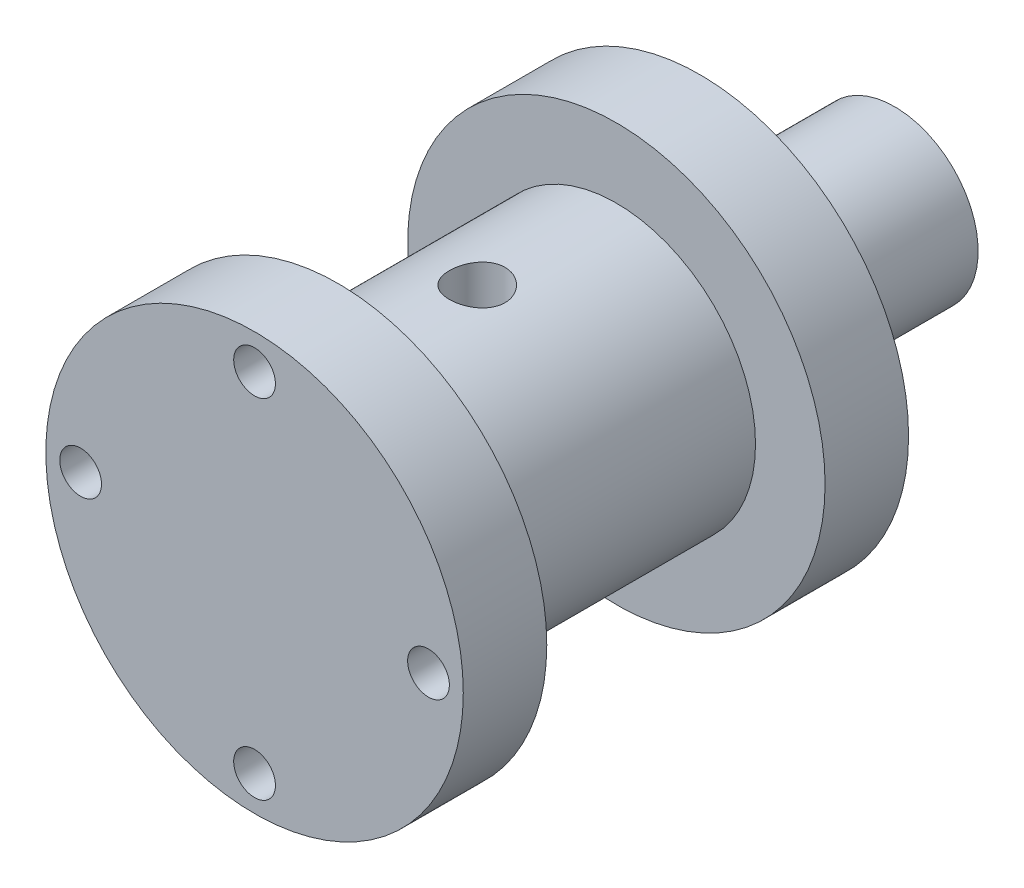
ISO-10303-21;
HEADER;
FILE_DESCRIPTION(('STEP AP214'),'2;1');
FILE_NAME('part.step','',(''),(''),'','','');
FILE_SCHEMA(('AUTOMOTIVE_DESIGN { 1 0 10303 214 1 1 1 1 }'));
ENDSEC;
DATA;
#1=APPLICATION_CONTEXT('core data for automotive mechanical design processes');
#2=APPLICATION_PROTOCOL_DEFINITION('international standard','automotive_design',2000,#1);
#3=PRODUCT_CONTEXT('',#1,'mechanical');
#4=PRODUCT('Part','Part','',(#3));
#5=PRODUCT_RELATED_PRODUCT_CATEGORY('part','',(#4));
#6=PRODUCT_DEFINITION_FORMATION('','',#4);
#7=PRODUCT_DEFINITION_CONTEXT('part definition',#1,'design');
#8=PRODUCT_DEFINITION('design','',#6,#7);
#9=PRODUCT_DEFINITION_SHAPE('','',#8);
#10=(LENGTH_UNIT() NAMED_UNIT(*) SI_UNIT(.MILLI.,.METRE.));
#11=(NAMED_UNIT(*) PLANE_ANGLE_UNIT() SI_UNIT($,.RADIAN.));
#12=(NAMED_UNIT(*) SI_UNIT($,.STERADIAN.) SOLID_ANGLE_UNIT());
#13=UNCERTAINTY_MEASURE_WITH_UNIT(LENGTH_MEASURE(1.E-05),#10,'distance_accuracy_value','');
#14=(GEOMETRIC_REPRESENTATION_CONTEXT(3) GLOBAL_UNCERTAINTY_ASSIGNED_CONTEXT((#13)) GLOBAL_UNIT_ASSIGNED_CONTEXT((#10,
#11,#12)) REPRESENTATION_CONTEXT('',''));
#15=CARTESIAN_POINT('',(0.,0.,0.));
#16=DIRECTION('',(0.,0.,1.));
#17=DIRECTION('',(1.,0.,0.));
#18=AXIS2_PLACEMENT_3D('',#15,#16,#17);
#19=CARTESIAN_POINT('',(0.,0.,-5.));
#20=DIRECTION('',(0.,0.,1.));
#21=DIRECTION('',(1.,0.,0.));
#22=AXIS2_PLACEMENT_3D('',#19,#20,#21);
#23=CYLINDRICAL_SURFACE('',#22,5.);
#24=CARTESIAN_POINT('',(0.,-5.,1.));
#25=CARTESIAN_POINT('',(-0.0555769067926332,-4.99999897580871,0.999997955501655));
#26=CARTESIAN_POINT('',(-0.111179660201522,-4.99906385178231,0.995351157032355));
#27=CARTESIAN_POINT('',(-0.220813507689019,-4.99542365623231,0.976901499884755));
#28=CARTESIAN_POINT('',(-0.274843317541356,-4.99271717860186,0.96309136719849));
#29=CARTESIAN_POINT('',(-0.379730305263313,-4.98583649278287,0.926758726379211));
#30=CARTESIAN_POINT('',(-0.430590467933134,-4.98166369076718,0.904244563155312));
#31=CARTESIAN_POINT('',(-0.527807988864225,-4.97230398035314,0.851167752488706));
#32=CARTESIAN_POINT('',(-0.574165615075812,-4.96711713235707,0.820605584392795));
#33=CARTESIAN_POINT('',(-0.661693477314865,-4.9562216532997,0.751861505708566));
#34=CARTESIAN_POINT('',(-0.702793951158524,-4.95050745504347,0.713591644608798));
#35=CARTESIAN_POINT('',(-0.778036756608028,-4.93924180452588,0.630707583608298));
#36=CARTESIAN_POINT('',(-0.812178544770424,-4.93369036500424,0.586092888664882));
#37=CARTESIAN_POINT('',(-0.87283175334762,-4.92332441812615,0.491283806988125));
#38=CARTESIAN_POINT('',(-0.899270938865866,-4.91851707364946,0.441042356203641));
#39=CARTESIAN_POINT('',(-0.943305666580308,-4.91026268058418,0.336718180995921));
#40=CARTESIAN_POINT('',(-0.960902082437238,-4.90681549761962,0.282635836653655));
#41=CARTESIAN_POINT('',(-0.986525299884827,-4.90172805252204,0.172915636092083));
#42=CARTESIAN_POINT('',(-0.994674497958777,-4.90006470107188,0.117307455857774));
#43=CARTESIAN_POINT('',(-1.00155212772612,-4.89866375060627,0.00549017863565777));
#44=CARTESIAN_POINT('',(-1.0002815227135,-4.89892595467841,-0.0507188563201451));
#45=CARTESIAN_POINT('',(-0.988454573101819,-4.90132551148185,-0.161246788021003));
#46=CARTESIAN_POINT('',(-0.978038540243905,-4.90343452858763,-0.215581405627314));
#47=CARTESIAN_POINT('',(-0.94843788462305,-4.90924546160001,-0.321716076663002));
#48=CARTESIAN_POINT('',(-0.929252843100681,-4.91294745357779,-0.373516008919008));
#49=CARTESIAN_POINT('',(-0.88252478367472,-4.92155618500408,-0.473515261703599));
#50=CARTESIAN_POINT('',(-0.854926151232114,-4.92647089813704,-0.521687879569172));
#51=CARTESIAN_POINT('',(-0.792193574572679,-4.93694618773062,-0.612770849972814));
#52=CARTESIAN_POINT('',(-0.757058764356829,-4.94250683838366,-0.655680596851157));
#53=CARTESIAN_POINT('',(-0.679499934560584,-4.95377021241462,-0.735829402456936));
#54=CARTESIAN_POINT('',(-0.636956161212445,-4.95947369210905,-0.77295256785913));
#55=CARTESIAN_POINT('',(-0.54618502406201,-4.97028848714408,-0.839553846301224));
#56=CARTESIAN_POINT('',(-0.497957587379389,-4.97539979488974,-0.869031861293579));
#57=CARTESIAN_POINT('',(-0.397059386878921,-4.98446690160887,-0.919527509225975));
#58=CARTESIAN_POINT('',(-0.3443818195853,-4.98842088848272,-0.940531893644537));
#59=CARTESIAN_POINT('',(-0.236148976448665,-4.99471408987858,-0.973360474038567));
#60=CARTESIAN_POINT('',(-0.18059405007245,-4.99705350000531,-0.985185782073628));
#61=CARTESIAN_POINT('',(-0.0691794056271506,-4.99982671866868,-0.999156453794277));
#62=CARTESIAN_POINT('',(-0.0133403283255764,-5.0002917465247,-1.00146041954027));
#63=CARTESIAN_POINT('',(0.0979249341927138,-4.99935051930103,-0.996750141057819));
#64=CARTESIAN_POINT('',(0.153351142443793,-4.99794436941446,-0.989736420647404));
#65=CARTESIAN_POINT('',(0.261705659946541,-4.99343832008018,-0.966721626456044));
#66=CARTESIAN_POINT('',(0.314651948339903,-4.99035376404206,-0.950801931502097));
#67=CARTESIAN_POINT('',(0.417123627499667,-4.98283552061033,-0.910516017344191));
#68=CARTESIAN_POINT('',(0.466648761637539,-4.97840173214227,-0.88614916532317));
#69=CARTESIAN_POINT('',(0.561541173686217,-4.96859911533294,-0.829317509348687));
#70=CARTESIAN_POINT('',(0.606850126752188,-4.96321950437052,-0.796757218961055));
#71=CARTESIAN_POINT('',(0.691418019119206,-4.95214734829882,-0.724590808792719));
#72=CARTESIAN_POINT('',(0.730676308930762,-4.94645476968388,-0.684983933600133));
#73=CARTESIAN_POINT('',(0.802640590774176,-4.93529303556965,-0.599126648108876));
#74=CARTESIAN_POINT('',(0.835237702448655,-4.92982860233304,-0.552784255778663));
#75=CARTESIAN_POINT('',(0.892185420051205,-4.91984191796194,-0.455188638643321));
#76=CARTESIAN_POINT('',(0.916536355922902,-4.91531962913342,-0.403935610426448));
#77=CARTESIAN_POINT('',(0.95615184158196,-4.90776740584383,-0.298231753850452));
#78=CARTESIAN_POINT('',(0.971463499791051,-4.90472974872186,-0.243799158789681));
#79=CARTESIAN_POINT('',(0.992708651627196,-4.90047436792025,-0.133066546509095));
#80=CARTESIAN_POINT('',(0.998643368225112,-4.89925640691111,-0.0767667737906529));
#81=CARTESIAN_POINT('',(1.00092091086747,-4.89879149631379,0.0350088645443183));
#82=CARTESIAN_POINT('',(0.997435788070896,-4.89950919189301,0.0904811489270091));
#83=CARTESIAN_POINT('',(0.981352304100061,-4.90275573484614,0.200031649905026));
#84=CARTESIAN_POINT('',(0.968754016129298,-4.90528456767169,0.254109877694805));
#85=CARTESIAN_POINT('',(0.934878568498954,-4.91185264219158,0.359227711240545));
#86=CARTESIAN_POINT('',(0.913622506717345,-4.9158882101883,0.410274360502415));
#87=CARTESIAN_POINT('',(0.863054644601604,-4.9250171497417,0.508103720734441));
#88=CARTESIAN_POINT('',(0.833742168774882,-4.93011060998894,0.554886073725137));
#89=CARTESIAN_POINT('',(0.767305914786414,-4.94088960523225,0.643715572150314));
#90=CARTESIAN_POINT('',(0.73005788723518,-4.94658372909699,0.685668765267595));
#91=CARTESIAN_POINT('',(0.649064369013141,-4.95786081871954,0.762786205529171));
#92=CARTESIAN_POINT('',(0.605317387153335,-4.96344375863184,0.797948890317272));
#93=CARTESIAN_POINT('',(0.512017629088247,-4.97393832387971,0.860834643946447));
#94=CARTESIAN_POINT('',(0.462408884429835,-4.97884231219246,0.888476003280025));
#95=CARTESIAN_POINT('',(0.359166360940733,-4.98735125085,0.934986122596591));
#96=CARTESIAN_POINT('',(0.305536260863126,-4.99095737138616,0.953862789532492));
#97=CARTESIAN_POINT('',(0.209821488923779,-4.9957637259537,0.978651948044716));
#98=CARTESIAN_POINT('',(0.168281664013784,-4.99734303158452,0.986643193707757));
#99=CARTESIAN_POINT('',(0.0844995252100667,-4.99946154139893,0.997317912358364));
#100=CARTESIAN_POINT('',(0.0422572337486189,-5.00000077873155,1.00000155450977));
#101=CARTESIAN_POINT('',(0.,-5.,1.));
#102=B_SPLINE_CURVE_WITH_KNOTS('',3,(#24,#25,#26,#27,#28,#29,#30,#31,#32,#33,#34,#35,#36,#37,
#38,#39,#40,#41,#42,#43,#44,#45,#46,#47,#48,#49,#50,#51,#52,#53,#54,#55,#56,#57,#58,#59,#60,#61,
#62,#63,#64,#65,#66,#67,#68,#69,#70,#71,#72,#73,#74,#75,#76,#77,#78,#79,#80,#81,#82,#83,#84,#85,
#86,#87,#88,#89,#90,#91,#92,#93,#94,#95,#96,#97,#98,#99,#100,#101),.UNSPECIFIED.,.T.,.F.,(4,2,2,
2,2,2,2,2,2,2,2,2,2,2,2,2,2,2,2,2,2,2,2,2,2,2,2,2,2,2,2,2,2,2,2,2,2,2,4),(0.,0.166576130661258,
0.333284650691323,0.499833735250341,0.666372902230863,0.834932670112186,1.00350559674737,
1.17361195005923,1.34370149365197,1.51156185103587,1.67940504281225,1.84471727006278,
2.0100373925373,2.17647490203593,2.3429315474967,2.51238252491351,2.6818356753982,
2.85155274854024,3.02124925698036,3.18810735676265,3.35495607657868,3.52030453950723,
3.68566539216022,3.85305066033359,4.0204538834593,4.19040628579226,4.36035188723466,
4.52940381032723,4.69843368330415,4.86439722567701,5.03035943492608,5.1959196125311,
5.36149367581866,5.52988076239143,5.6983065453293,5.86849496675637,6.03852955517518,
6.16518775289894,6.29184191370996),.UNSPECIFIED.);
#103=CARTESIAN_POINT('',(0.,-5.,1.));
#104=VERTEX_POINT('',#103);
#105=EDGE_CURVE('E37',#104,#104,#102,.T.);
#106=ORIENTED_EDGE('',*,*,#105,.F.);
#107=EDGE_LOOP('',(#106));
#108=FACE_BOUND('',#107,.T.);
#109=CARTESIAN_POINT('',(0.,5.,1.));
#110=CARTESIAN_POINT('',(0.0555769067926332,4.99999897580871,0.999997955501655));
#111=CARTESIAN_POINT('',(0.111179660201522,4.99906385178231,0.995351157032355));
#112=CARTESIAN_POINT('',(0.220813507689019,4.99542365623231,0.976901499884755));
#113=CARTESIAN_POINT('',(0.274843317541356,4.99271717860186,0.96309136719849));
#114=CARTESIAN_POINT('',(0.379730305263313,4.98583649278287,0.926758726379211));
#115=CARTESIAN_POINT('',(0.430590467933134,4.98166369076718,0.904244563155312));
#116=CARTESIAN_POINT('',(0.527807988864225,4.97230398035314,0.851167752488706));
#117=CARTESIAN_POINT('',(0.574165615075812,4.96711713235707,0.820605584392795));
#118=CARTESIAN_POINT('',(0.661693477314865,4.9562216532997,0.751861505708566));
#119=CARTESIAN_POINT('',(0.702793951158524,4.95050745504347,0.713591644608798));
#120=CARTESIAN_POINT('',(0.778036756608028,4.93924180452588,0.630707583608298));
#121=CARTESIAN_POINT('',(0.812178544770424,4.93369036500424,0.586092888664882));
#122=CARTESIAN_POINT('',(0.87283175334762,4.92332441812615,0.491283806988125));
#123=CARTESIAN_POINT('',(0.899270938865866,4.91851707364946,0.441042356203641));
#124=CARTESIAN_POINT('',(0.943305666580308,4.91026268058418,0.336718180995921));
#125=CARTESIAN_POINT('',(0.960902082437238,4.90681549761962,0.282635836653655));
#126=CARTESIAN_POINT('',(0.986525299884827,4.90172805252204,0.172915636092083));
#127=CARTESIAN_POINT('',(0.994674497958777,4.90006470107188,0.117307455857774));
#128=CARTESIAN_POINT('',(1.00155212772612,4.89866375060627,0.00549017863565777));
#129=CARTESIAN_POINT('',(1.0002815227135,4.89892595467841,-0.0507188563201451));
#130=CARTESIAN_POINT('',(0.988454573101819,4.90132551148185,-0.161246788021003));
#131=CARTESIAN_POINT('',(0.978038540243905,4.90343452858763,-0.215581405627314));
#132=CARTESIAN_POINT('',(0.94843788462305,4.90924546160001,-0.321716076663002));
#133=CARTESIAN_POINT('',(0.929252843100681,4.91294745357779,-0.373516008919008));
#134=CARTESIAN_POINT('',(0.88252478367472,4.92155618500408,-0.473515261703599));
#135=CARTESIAN_POINT('',(0.854926151232114,4.92647089813704,-0.521687879569172));
#136=CARTESIAN_POINT('',(0.792193574572679,4.93694618773062,-0.612770849972814));
#137=CARTESIAN_POINT('',(0.757058764356829,4.94250683838366,-0.655680596851157));
#138=CARTESIAN_POINT('',(0.679499934560584,4.95377021241462,-0.735829402456936));
#139=CARTESIAN_POINT('',(0.636956161212445,4.95947369210905,-0.77295256785913));
#140=CARTESIAN_POINT('',(0.54618502406201,4.97028848714408,-0.839553846301224));
#141=CARTESIAN_POINT('',(0.497957587379389,4.97539979488974,-0.869031861293579));
#142=CARTESIAN_POINT('',(0.397059386878921,4.98446690160887,-0.919527509225975));
#143=CARTESIAN_POINT('',(0.3443818195853,4.98842088848272,-0.940531893644537));
#144=CARTESIAN_POINT('',(0.236148976448665,4.99471408987858,-0.973360474038567));
#145=CARTESIAN_POINT('',(0.18059405007245,4.99705350000531,-0.985185782073628));
#146=CARTESIAN_POINT('',(0.0691794056271506,4.99982671866868,-0.999156453794277));
#147=CARTESIAN_POINT('',(0.0133403283255764,5.0002917465247,-1.00146041954027));
#148=CARTESIAN_POINT('',(-0.0979249341927138,4.99935051930103,-0.996750141057819));
#149=CARTESIAN_POINT('',(-0.153351142443793,4.99794436941446,-0.989736420647404));
#150=CARTESIAN_POINT('',(-0.261705659946541,4.99343832008018,-0.966721626456044));
#151=CARTESIAN_POINT('',(-0.314651948339903,4.99035376404206,-0.950801931502097));
#152=CARTESIAN_POINT('',(-0.417123627499667,4.98283552061033,-0.910516017344191));
#153=CARTESIAN_POINT('',(-0.466648761637539,4.97840173214227,-0.88614916532317));
#154=CARTESIAN_POINT('',(-0.561541173686217,4.96859911533294,-0.829317509348687));
#155=CARTESIAN_POINT('',(-0.606850126752188,4.96321950437052,-0.796757218961055));
#156=CARTESIAN_POINT('',(-0.691418019119206,4.95214734829882,-0.724590808792719));
#157=CARTESIAN_POINT('',(-0.730676308930762,4.94645476968388,-0.684983933600133));
#158=CARTESIAN_POINT('',(-0.802640590774176,4.93529303556965,-0.599126648108876));
#159=CARTESIAN_POINT('',(-0.835237702448655,4.92982860233304,-0.552784255778663));
#160=CARTESIAN_POINT('',(-0.892185420051205,4.91984191796194,-0.455188638643321));
#161=CARTESIAN_POINT('',(-0.916536355922902,4.91531962913342,-0.403935610426448));
#162=CARTESIAN_POINT('',(-0.95615184158196,4.90776740584383,-0.298231753850452));
#163=CARTESIAN_POINT('',(-0.971463499791051,4.90472974872186,-0.243799158789681));
#164=CARTESIAN_POINT('',(-0.992708651627196,4.90047436792025,-0.133066546509095));
#165=CARTESIAN_POINT('',(-0.998643368225112,4.89925640691111,-0.0767667737906529));
#166=CARTESIAN_POINT('',(-1.00092091086747,4.89879149631379,0.0350088645443183));
#167=CARTESIAN_POINT('',(-0.997435788070896,4.89950919189301,0.0904811489270091));
#168=CARTESIAN_POINT('',(-0.981352304100061,4.90275573484614,0.200031649905026));
#169=CARTESIAN_POINT('',(-0.968754016129298,4.90528456767169,0.254109877694805));
#170=CARTESIAN_POINT('',(-0.934878568498954,4.91185264219158,0.359227711240545));
#171=CARTESIAN_POINT('',(-0.913622506717345,4.9158882101883,0.410274360502415));
#172=CARTESIAN_POINT('',(-0.863054644601604,4.9250171497417,0.508103720734441));
#173=CARTESIAN_POINT('',(-0.833742168774882,4.93011060998894,0.554886073725137));
#174=CARTESIAN_POINT('',(-0.767305914786414,4.94088960523225,0.643715572150314));
#175=CARTESIAN_POINT('',(-0.73005788723518,4.94658372909699,0.685668765267595));
#176=CARTESIAN_POINT('',(-0.649064369013141,4.95786081871954,0.762786205529171));
#177=CARTESIAN_POINT('',(-0.605317387153335,4.96344375863184,0.797948890317272));
#178=CARTESIAN_POINT('',(-0.512017629088247,4.97393832387971,0.860834643946447));
#179=CARTESIAN_POINT('',(-0.462408884429835,4.97884231219246,0.888476003280025));
#180=CARTESIAN_POINT('',(-0.359166360940733,4.98735125085,0.934986122596591));
#181=CARTESIAN_POINT('',(-0.305536260863126,4.99095737138616,0.953862789532492));
#182=CARTESIAN_POINT('',(-0.209821488923779,4.9957637259537,0.978651948044716));
#183=CARTESIAN_POINT('',(-0.168281664013784,4.99734303158452,0.986643193707757));
#184=CARTESIAN_POINT('',(-0.0844995252100667,4.99946154139893,0.997317912358364));
#185=CARTESIAN_POINT('',(-0.0422572337486189,5.00000077873155,1.00000155450977));
#186=CARTESIAN_POINT('',(0.,5.,1.));
#187=B_SPLINE_CURVE_WITH_KNOTS('',3,(#109,#110,#111,#112,#113,#114,#115,#116,#117,#118,#119,
#120,#121,#122,#123,#124,#125,#126,#127,#128,#129,#130,#131,#132,#133,#134,#135,#136,#137,#138,
#139,#140,#141,#142,#143,#144,#145,#146,#147,#148,#149,#150,#151,#152,#153,#154,#155,#156,#157,
#158,#159,#160,#161,#162,#163,#164,#165,#166,#167,#168,#169,#170,#171,#172,#173,#174,#175,#176,
#177,#178,#179,#180,#181,#182,#183,#184,#185,#186),.UNSPECIFIED.,.T.,.F.,(4,2,2,2,2,2,2,2,2,2,2,
2,2,2,2,2,2,2,2,2,2,2,2,2,2,2,2,2,2,2,2,2,2,2,2,2,2,2,4),(0.,0.166576130661258,
0.333284650691323,0.499833735250341,0.666372902230863,0.834932670112186,1.00350559674737,
1.17361195005923,1.34370149365197,1.51156185103587,1.67940504281225,1.84471727006278,
2.0100373925373,2.17647490203593,2.3429315474967,2.51238252491351,2.6818356753982,
2.85155274854024,3.02124925698036,3.18810735676265,3.35495607657868,3.52030453950723,
3.68566539216022,3.85305066033359,4.0204538834593,4.19040628579226,4.36035188723466,
4.52940381032723,4.69843368330415,4.86439722567701,5.03035943492608,5.1959196125311,
5.36149367581866,5.52988076239143,5.6983065453293,5.86849496675637,6.03852955517518,
6.16518775289894,6.29184191370996),.UNSPECIFIED.);
#188=CARTESIAN_POINT('',(0.,5.,1.));
#189=VERTEX_POINT('',#188);
#190=EDGE_CURVE('E45',#189,#189,#187,.T.);
#191=ORIENTED_EDGE('',*,*,#190,.F.);
#192=EDGE_LOOP('',(#191));
#193=FACE_BOUND('',#192,.T.);
#194=CARTESIAN_POINT('',(0.,0.,-5.));
#195=DIRECTION('',(0.,0.,1.));
#196=DIRECTION('',(1.,0.,0.));
#197=AXIS2_PLACEMENT_3D('',#194,#195,#196);
#198=CIRCLE('',#197,5.);
#199=CARTESIAN_POINT('',(5.,0.,-5.));
#200=VERTEX_POINT('',#199);
#201=EDGE_CURVE('E81',#200,#200,#198,.T.);
#202=ORIENTED_EDGE('',*,*,#201,.T.);
#203=EDGE_LOOP('',(#202));
#204=FACE_BOUND('',#203,.T.);
#205=CARTESIAN_POINT('',(0.,0.,5.));
#206=DIRECTION('',(0.,0.,1.));
#207=DIRECTION('',(1.,0.,0.));
#208=AXIS2_PLACEMENT_3D('',#205,#206,#207);
#209=CIRCLE('',#208,5.);
#210=CARTESIAN_POINT('',(5.,0.,5.));
#211=VERTEX_POINT('',#210);
#212=EDGE_CURVE('E50',#211,#211,#209,.T.);
#213=ORIENTED_EDGE('',*,*,#212,.F.);
#214=EDGE_LOOP('',(#213));
#215=FACE_BOUND('',#214,.T.);
#216=ADVANCED_FACE('F33',(#108,#193,#204,#215),#23,.T.);
#217=CARTESIAN_POINT('',(0.,0.,8.));
#218=DIRECTION('',(0.,0.,-1.));
#219=DIRECTION('',(-1.,0.,0.));
#220=AXIS2_PLACEMENT_3D('',#217,#218,#219);
#221=CYLINDRICAL_SURFACE('',#220,7.5);
#222=CARTESIAN_POINT('',(0.,0.,8.));
#223=DIRECTION('',(0.,0.,1.));
#224=DIRECTION('',(1.,0.,0.));
#225=AXIS2_PLACEMENT_3D('',#222,#223,#224);
#226=CIRCLE('',#225,7.5);
#227=CARTESIAN_POINT('',(7.5,0.,8.));
#228=VERTEX_POINT('',#227);
#229=EDGE_CURVE('E85',#228,#228,#226,.T.);
#230=ORIENTED_EDGE('',*,*,#229,.F.);
#231=EDGE_LOOP('',(#230));
#232=FACE_BOUND('',#231,.T.);
#233=CARTESIAN_POINT('',(0.,0.,5.));
#234=DIRECTION('',(0.,0.,1.));
#235=DIRECTION('',(1.,0.,0.));
#236=AXIS2_PLACEMENT_3D('',#233,#234,#235);
#237=CIRCLE('',#236,7.5);
#238=CARTESIAN_POINT('',(7.5,0.,5.));
#239=VERTEX_POINT('',#238);
#240=EDGE_CURVE('E88',#239,#239,#237,.T.);
#241=ORIENTED_EDGE('',*,*,#240,.T.);
#242=EDGE_LOOP('',(#241));
#243=FACE_BOUND('',#242,.T.);
#244=ADVANCED_FACE('F122',(#232,#243),#221,.T.);
#245=CARTESIAN_POINT('',(0.,0.,8.));
#246=DIRECTION('',(0.,0.,1.));
#247=DIRECTION('',(1.,0.,0.));
#248=AXIS2_PLACEMENT_3D('',#245,#246,#247);
#249=PLANE('',#248);
#250=CARTESIAN_POINT('',(6.25,0.,8.));
#251=DIRECTION('',(0.,0.,-1.));
#252=DIRECTION('',(0.,1.,0.));
#253=AXIS2_PLACEMENT_3D('',#250,#251,#252);
#254=CIRCLE('',#253,0.75);
#255=CARTESIAN_POINT('',(6.25,0.749999999999978,8.));
#256=VERTEX_POINT('',#255);
#257=EDGE_CURVE('E54',#256,#256,#254,.T.);
#258=ORIENTED_EDGE('',*,*,#257,.T.);
#259=EDGE_LOOP('',(#258));
#260=FACE_BOUND('',#259,.T.);
#261=CARTESIAN_POINT('',(0.,-6.25,8.));
#262=DIRECTION('',(0.,0.,-1.));
#263=DIRECTION('',(1.,0.,0.));
#264=AXIS2_PLACEMENT_3D('',#261,#262,#263);
#265=CIRCLE('',#264,0.75);
#266=CARTESIAN_POINT('',(0.75,-6.25,8.));
#267=VERTEX_POINT('',#266);
#268=EDGE_CURVE('E61',#267,#267,#265,.T.);
#269=ORIENTED_EDGE('',*,*,#268,.T.);
#270=EDGE_LOOP('',(#269));
#271=FACE_BOUND('',#270,.T.);
#272=CARTESIAN_POINT('',(-6.25,0.,8.));
#273=DIRECTION('',(0.,0.,-1.));
#274=DIRECTION('',(0.,-1.,0.));
#275=AXIS2_PLACEMENT_3D('',#272,#273,#274);
#276=CIRCLE('',#275,0.75);
#277=CARTESIAN_POINT('',(-6.25000000000001,-0.749999999999934,8.));
#278=VERTEX_POINT('',#277);
#279=EDGE_CURVE('E67',#278,#278,#276,.T.);
#280=ORIENTED_EDGE('',*,*,#279,.T.);
#281=EDGE_LOOP('',(#280));
#282=FACE_BOUND('',#281,.T.);
#283=CARTESIAN_POINT('',(0.,6.25,8.));
#284=DIRECTION('',(0.,0.,-1.));
#285=DIRECTION('',(-1.,0.,0.));
#286=AXIS2_PLACEMENT_3D('',#283,#284,#285);
#287=CIRCLE('',#286,0.75);
#288=CARTESIAN_POINT('',(-0.75,6.25,8.));
#289=VERTEX_POINT('',#288);
#290=EDGE_CURVE('E73',#289,#289,#287,.T.);
#291=ORIENTED_EDGE('',*,*,#290,.T.);
#292=EDGE_LOOP('',(#291));
#293=FACE_BOUND('',#292,.T.);
#294=ORIENTED_EDGE('',*,*,#229,.T.);
#295=EDGE_LOOP('',(#294));
#296=FACE_BOUND('',#295,.T.);
#297=ADVANCED_FACE('F119',(#260,#271,#282,#293,#296),#249,.T.);
#298=CARTESIAN_POINT('',(0.,0.,5.));
#299=DIRECTION('',(0.,0.,1.));
#300=DIRECTION('',(1.,0.,0.));
#301=AXIS2_PLACEMENT_3D('',#298,#299,#300);
#302=PLANE('',#301);
#303=CARTESIAN_POINT('',(6.25,0.,5.));
#304=DIRECTION('',(0.,0.,-1.));
#305=DIRECTION('',(0.,1.,0.));
#306=AXIS2_PLACEMENT_3D('',#303,#304,#305);
#307=CIRCLE('',#306,0.75);
#308=CARTESIAN_POINT('',(6.25,0.749999999999978,5.));
#309=VERTEX_POINT('',#308);
#310=EDGE_CURVE('E58',#309,#309,#307,.T.);
#311=ORIENTED_EDGE('',*,*,#310,.F.);
#312=EDGE_LOOP('',(#311));
#313=FACE_BOUND('',#312,.T.);
#314=CARTESIAN_POINT('',(0.,-6.25,5.));
#315=DIRECTION('',(0.,0.,-1.));
#316=DIRECTION('',(1.,0.,0.));
#317=AXIS2_PLACEMENT_3D('',#314,#315,#316);
#318=CIRCLE('',#317,0.75);
#319=CARTESIAN_POINT('',(0.75,-6.25,5.));
#320=VERTEX_POINT('',#319);
#321=EDGE_CURVE('E64',#320,#320,#318,.T.);
#322=ORIENTED_EDGE('',*,*,#321,.F.);
#323=EDGE_LOOP('',(#322));
#324=FACE_BOUND('',#323,.T.);
#325=CARTESIAN_POINT('',(-6.25,0.,5.));
#326=DIRECTION('',(0.,0.,-1.));
#327=DIRECTION('',(0.,-1.,0.));
#328=AXIS2_PLACEMENT_3D('',#325,#326,#327);
#329=CIRCLE('',#328,0.75);
#330=CARTESIAN_POINT('',(-6.25000000000001,-0.749999999999934,5.));
#331=VERTEX_POINT('',#330);
#332=EDGE_CURVE('E70',#331,#331,#329,.T.);
#333=ORIENTED_EDGE('',*,*,#332,.F.);
#334=EDGE_LOOP('',(#333));
#335=FACE_BOUND('',#334,.T.);
#336=CARTESIAN_POINT('',(0.,6.25,5.));
#337=DIRECTION('',(0.,0.,-1.));
#338=DIRECTION('',(-1.,0.,0.));
#339=AXIS2_PLACEMENT_3D('',#336,#337,#338);
#340=CIRCLE('',#339,0.75);
#341=CARTESIAN_POINT('',(-0.75,6.25,5.));
#342=VERTEX_POINT('',#341);
#343=EDGE_CURVE('E57',#342,#342,#340,.T.);
#344=ORIENTED_EDGE('',*,*,#343,.F.);
#345=EDGE_LOOP('',(#344));
#346=FACE_BOUND('',#345,.T.);
#347=ORIENTED_EDGE('',*,*,#212,.T.);
#348=EDGE_LOOP('',(#347));
#349=FACE_BOUND('',#348,.T.);
#350=ORIENTED_EDGE('',*,*,#240,.F.);
#351=EDGE_LOOP('',(#350));
#352=FACE_BOUND('',#351,.T.);
#353=ADVANCED_FACE('F117',(#313,#324,#335,#346,#349,#352),#302,.F.);
#354=CARTESIAN_POINT('',(0.,0.,-8.));
#355=DIRECTION('',(0.,0.,1.));
#356=DIRECTION('',(1.,0.,0.));
#357=AXIS2_PLACEMENT_3D('',#354,#355,#356);
#358=CYLINDRICAL_SURFACE('',#357,7.5);
#359=CARTESIAN_POINT('',(0.,0.,-8.));
#360=DIRECTION('',(0.,0.,1.));
#361=DIRECTION('',(1.,0.,0.));
#362=AXIS2_PLACEMENT_3D('',#359,#360,#361);
#363=CIRCLE('',#362,7.5);
#364=CARTESIAN_POINT('',(7.5,0.,-8.));
#365=VERTEX_POINT('',#364);
#366=EDGE_CURVE('E78',#365,#365,#363,.T.);
#367=ORIENTED_EDGE('',*,*,#366,.T.);
#368=EDGE_LOOP('',(#367));
#369=FACE_BOUND('',#368,.T.);
#370=CARTESIAN_POINT('',(0.,0.,-5.));
#371=DIRECTION('',(0.,0.,1.));
#372=DIRECTION('',(1.,0.,0.));
#373=AXIS2_PLACEMENT_3D('',#370,#371,#372);
#374=CIRCLE('',#373,7.5);
#375=CARTESIAN_POINT('',(7.5,0.,-5.));
#376=VERTEX_POINT('',#375);
#377=EDGE_CURVE('E82',#376,#376,#374,.T.);
#378=ORIENTED_EDGE('',*,*,#377,.F.);
#379=EDGE_LOOP('',(#378));
#380=FACE_BOUND('',#379,.T.);
#381=ADVANCED_FACE('F110',(#369,#380),#358,.T.);
#382=CARTESIAN_POINT('',(0.,0.,-8.));
#383=DIRECTION('',(0.,0.,-1.));
#384=DIRECTION('',(1.,0.,0.));
#385=AXIS2_PLACEMENT_3D('',#382,#383,#384);
#386=PLANE('',#385);
#387=CARTESIAN_POINT('',(0.,0.,-8.));
#388=DIRECTION('',(0.,0.,-1.));
#389=DIRECTION('',(-1.,0.,0.));
#390=AXIS2_PLACEMENT_3D('',#387,#388,#389);
#391=CIRCLE('',#390,3.);
#392=CARTESIAN_POINT('',(-3.,0.,-8.));
#393=VERTEX_POINT('',#392);
#394=EDGE_CURVE('E10',#393,#393,#391,.T.);
#395=ORIENTED_EDGE('',*,*,#394,.F.);
#396=EDGE_LOOP('',(#395));
#397=FACE_BOUND('',#396,.T.);
#398=ORIENTED_EDGE('',*,*,#366,.F.);
#399=EDGE_LOOP('',(#398));
#400=FACE_BOUND('',#399,.T.);
#401=ADVANCED_FACE('F106',(#397,#400),#386,.T.);
#402=CARTESIAN_POINT('',(0.,0.,-5.));
#403=DIRECTION('',(0.,0.,-1.));
#404=DIRECTION('',(1.,0.,0.));
#405=AXIS2_PLACEMENT_3D('',#402,#403,#404);
#406=PLANE('',#405);
#407=ORIENTED_EDGE('',*,*,#201,.F.);
#408=EDGE_LOOP('',(#407));
#409=FACE_BOUND('',#408,.T.);
#410=ORIENTED_EDGE('',*,*,#377,.T.);
#411=EDGE_LOOP('',(#410));
#412=FACE_BOUND('',#411,.T.);
#413=ADVANCED_FACE('F103',(#409,#412),#406,.F.);
#414=CARTESIAN_POINT('',(0.,-7.5,0.));
#415=DIRECTION('',(0.,1.,0.));
#416=DIRECTION('',(0.,0.,1.));
#417=AXIS2_PLACEMENT_3D('',#414,#415,#416);
#418=CYLINDRICAL_SURFACE('',#417,1.);
#419=ORIENTED_EDGE('',*,*,#190,.T.);
#420=EDGE_LOOP('',(#419));
#421=FACE_BOUND('',#420,.T.);
#422=ORIENTED_EDGE('',*,*,#105,.T.);
#423=EDGE_LOOP('',(#422));
#424=FACE_BOUND('',#423,.T.);
#425=ADVANCED_FACE('F97',(#421,#424),#418,.F.);
#426=CARTESIAN_POINT('',(0.,6.25,8.));
#427=DIRECTION('',(0.,0.,-1.));
#428=DIRECTION('',(-1.,0.,0.));
#429=AXIS2_PLACEMENT_3D('',#426,#427,#428);
#430=CYLINDRICAL_SURFACE('',#429,0.75);
#431=ORIENTED_EDGE('',*,*,#290,.F.);
#432=EDGE_LOOP('',(#431));
#433=FACE_BOUND('',#432,.T.);
#434=ORIENTED_EDGE('',*,*,#343,.T.);
#435=EDGE_LOOP('',(#434));
#436=FACE_BOUND('',#435,.T.);
#437=ADVANCED_FACE('F102',(#433,#436),#430,.F.);
#438=CARTESIAN_POINT('',(-6.25,0.,8.));
#439=DIRECTION('',(0.,0.,-1.));
#440=DIRECTION('',(-1.,0.,0.));
#441=AXIS2_PLACEMENT_3D('',#438,#439,#440);
#442=CYLINDRICAL_SURFACE('',#441,0.75);
#443=ORIENTED_EDGE('',*,*,#279,.F.);
#444=EDGE_LOOP('',(#443));
#445=FACE_BOUND('',#444,.T.);
#446=ORIENTED_EDGE('',*,*,#332,.T.);
#447=EDGE_LOOP('',(#446));
#448=FACE_BOUND('',#447,.T.);
#449=ADVANCED_FACE('F172',(#445,#448),#442,.F.);
#450=CARTESIAN_POINT('',(0.,-6.25,8.));
#451=DIRECTION('',(0.,0.,-1.));
#452=DIRECTION('',(-1.,0.,0.));
#453=AXIS2_PLACEMENT_3D('',#450,#451,#452);
#454=CYLINDRICAL_SURFACE('',#453,0.75);
#455=ORIENTED_EDGE('',*,*,#268,.F.);
#456=EDGE_LOOP('',(#455));
#457=FACE_BOUND('',#456,.T.);
#458=ORIENTED_EDGE('',*,*,#321,.T.);
#459=EDGE_LOOP('',(#458));
#460=FACE_BOUND('',#459,.T.);
#461=ADVANCED_FACE('F194',(#457,#460),#454,.F.);
#462=CARTESIAN_POINT('',(6.25,0.,8.));
#463=DIRECTION('',(0.,0.,-1.));
#464=DIRECTION('',(-1.,0.,0.));
#465=AXIS2_PLACEMENT_3D('',#462,#463,#464);
#466=CYLINDRICAL_SURFACE('',#465,0.75);
#467=ORIENTED_EDGE('',*,*,#257,.F.);
#468=EDGE_LOOP('',(#467));
#469=FACE_BOUND('',#468,.T.);
#470=ORIENTED_EDGE('',*,*,#310,.T.);
#471=EDGE_LOOP('',(#470));
#472=FACE_BOUND('',#471,.T.);
#473=ADVANCED_FACE('F203',(#469,#472),#466,.F.);
#474=CARTESIAN_POINT('',(0.,0.,-15.));
#475=DIRECTION('',(0.,0.,1.));
#476=DIRECTION('',(1.,0.,0.));
#477=AXIS2_PLACEMENT_3D('',#474,#475,#476);
#478=CYLINDRICAL_SURFACE('',#477,3.);
#479=CARTESIAN_POINT('',(0.,0.,-15.));
#480=DIRECTION('',(0.,0.,-1.));
#481=DIRECTION('',(-1.,0.,0.));
#482=AXIS2_PLACEMENT_3D('',#479,#480,#481);
#483=CIRCLE('',#482,3.);
#484=CARTESIAN_POINT('',(-3.,0.,-15.));
#485=VERTEX_POINT('',#484);
#486=EDGE_CURVE('E53',#485,#485,#483,.T.);
#487=ORIENTED_EDGE('',*,*,#486,.F.);
#488=EDGE_LOOP('',(#487));
#489=FACE_BOUND('',#488,.T.);
#490=ORIENTED_EDGE('',*,*,#394,.T.);
#491=EDGE_LOOP('',(#490));
#492=FACE_BOUND('',#491,.T.);
#493=ADVANCED_FACE('F212',(#489,#492),#478,.T.);
#494=CARTESIAN_POINT('',(0.,0.,-15.));
#495=DIRECTION('',(0.,0.,-1.));
#496=DIRECTION('',(-1.,0.,0.));
#497=AXIS2_PLACEMENT_3D('',#494,#495,#496);
#498=PLANE('',#497);
#499=ORIENTED_EDGE('',*,*,#486,.T.);
#500=EDGE_LOOP('',(#499));
#501=FACE_BOUND('',#500,.T.);
#502=ADVANCED_FACE('F227',(#501),#498,.T.);
#503=CLOSED_SHELL('',(#216,#244,#297,#353,#381,#401,#413,#425,#437,#449,#461,#473,#493,#502));
#504=MANIFOLD_SOLID_BREP('B2',#503);
#505=ADVANCED_BREP_SHAPE_REPRESENTATION('',(#18,#504),#14);
#506=SHAPE_DEFINITION_REPRESENTATION(#9,#505);
ENDSEC;
END-ISO-10303-21;
